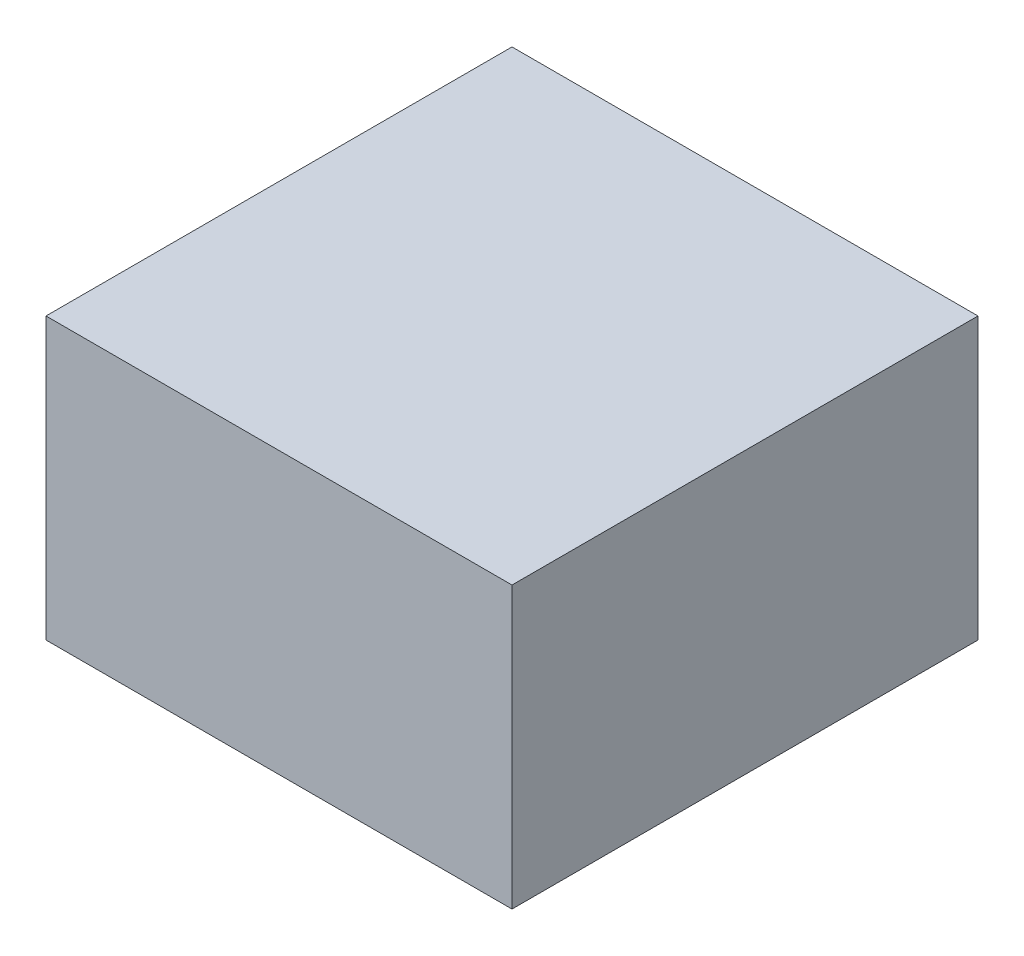
ISO-10303-21;
HEADER;
FILE_DESCRIPTION(('STEP AP214'),'2;1');
FILE_NAME('part.step','',(''),(''),'','','');
FILE_SCHEMA(('AUTOMOTIVE_DESIGN { 1 0 10303 214 1 1 1 1 }'));
ENDSEC;
DATA;
#1=APPLICATION_CONTEXT('core data for automotive mechanical design processes');
#2=APPLICATION_PROTOCOL_DEFINITION('international standard','automotive_design',2000,#1);
#3=PRODUCT_CONTEXT('',#1,'mechanical');
#4=PRODUCT('Part','Part','',(#3));
#5=PRODUCT_RELATED_PRODUCT_CATEGORY('part','',(#4));
#6=PRODUCT_DEFINITION_FORMATION('','',#4);
#7=PRODUCT_DEFINITION_CONTEXT('part definition',#1,'design');
#8=PRODUCT_DEFINITION('design','',#6,#7);
#9=PRODUCT_DEFINITION_SHAPE('','',#8);
#10=(LENGTH_UNIT() NAMED_UNIT(*) SI_UNIT(.MILLI.,.METRE.));
#11=(NAMED_UNIT(*) PLANE_ANGLE_UNIT() SI_UNIT($,.RADIAN.));
#12=(NAMED_UNIT(*) SI_UNIT($,.STERADIAN.) SOLID_ANGLE_UNIT());
#13=UNCERTAINTY_MEASURE_WITH_UNIT(LENGTH_MEASURE(1.E-05),#10,'distance_accuracy_value','');
#14=(GEOMETRIC_REPRESENTATION_CONTEXT(3) GLOBAL_UNCERTAINTY_ASSIGNED_CONTEXT((#13)) GLOBAL_UNIT_ASSIGNED_CONTEXT((#10,
#11,#12)) REPRESENTATION_CONTEXT('',''));
#15=CARTESIAN_POINT('',(0.,0.,0.));
#16=DIRECTION('',(0.,0.,1.));
#17=DIRECTION('',(1.,0.,0.));
#18=AXIS2_PLACEMENT_3D('',#15,#16,#17);
#19=CARTESIAN_POINT('',(22.,26.5,-22.));
#20=DIRECTION('',(-1.,0.,0.));
#21=DIRECTION('',(0.,0.,1.));
#22=AXIS2_PLACEMENT_3D('',#19,#20,#21);
#23=PLANE('',#22);
#24=DIRECTION('',(0.,0.,-1.));
#25=VECTOR('',#24,1.);
#26=CARTESIAN_POINT('',(22.,0.,-22.));
#27=LINE('',#26,#25);
#28=CARTESIAN_POINT('',(22.,0.,22.));
#29=VERTEX_POINT('',#28);
#30=CARTESIAN_POINT('',(22.,0.,-22.));
#31=VERTEX_POINT('',#30);
#32=EDGE_CURVE('E95',#29,#31,#27,.T.);
#33=ORIENTED_EDGE('',*,*,#32,.T.);
#34=DIRECTION('',(0.,-1.,0.));
#35=VECTOR('',#34,1.);
#36=CARTESIAN_POINT('',(22.,26.5,-22.));
#37=LINE('',#36,#35);
#38=CARTESIAN_POINT('',(22.,26.5,-22.));
#39=VERTEX_POINT('',#38);
#40=EDGE_CURVE('E11',#39,#31,#37,.T.);
#41=ORIENTED_EDGE('',*,*,#40,.F.);
#42=DIRECTION('',(0.,0.,-1.));
#43=VECTOR('',#42,1.);
#44=CARTESIAN_POINT('',(22.,26.5,-22.));
#45=LINE('',#44,#43);
#46=CARTESIAN_POINT('',(22.,26.5,22.));
#47=VERTEX_POINT('',#46);
#48=EDGE_CURVE('E83',#47,#39,#45,.T.);
#49=ORIENTED_EDGE('',*,*,#48,.F.);
#50=DIRECTION('',(0.,-1.,0.));
#51=VECTOR('',#50,1.);
#52=CARTESIAN_POINT('',(22.,26.5,22.));
#53=LINE('',#52,#51);
#54=EDGE_CURVE('E91',#47,#29,#53,.T.);
#55=ORIENTED_EDGE('',*,*,#54,.T.);
#56=EDGE_LOOP('',(#33,#41,#49,#55));
#57=FACE_BOUND('',#56,.T.);
#58=ADVANCED_FACE('F32',(#57),#23,.F.);
#59=CARTESIAN_POINT('',(-22.,26.5,-22.));
#60=DIRECTION('',(0.,0.,1.));
#61=DIRECTION('',(1.,0.,0.));
#62=AXIS2_PLACEMENT_3D('',#59,#60,#61);
#63=PLANE('',#62);
#64=DIRECTION('',(-1.,0.,0.));
#65=VECTOR('',#64,1.);
#66=CARTESIAN_POINT('',(-22.,0.,-22.));
#67=LINE('',#66,#65);
#68=CARTESIAN_POINT('',(-22.,0.,-22.));
#69=VERTEX_POINT('',#68);
#70=EDGE_CURVE('E87',#31,#69,#67,.T.);
#71=ORIENTED_EDGE('',*,*,#70,.T.);
#72=DIRECTION('',(0.,-1.,0.));
#73=VECTOR('',#72,1.);
#74=CARTESIAN_POINT('',(-22.,26.5,-22.));
#75=LINE('',#74,#73);
#76=CARTESIAN_POINT('',(-22.,26.5,-22.));
#77=VERTEX_POINT('',#76);
#78=EDGE_CURVE('E40',#77,#69,#75,.T.);
#79=ORIENTED_EDGE('',*,*,#78,.F.);
#80=DIRECTION('',(-1.,0.,0.));
#81=VECTOR('',#80,1.);
#82=CARTESIAN_POINT('',(-22.,26.5,-22.));
#83=LINE('',#82,#81);
#84=EDGE_CURVE('E78',#39,#77,#83,.T.);
#85=ORIENTED_EDGE('',*,*,#84,.F.);
#86=ORIENTED_EDGE('',*,*,#40,.T.);
#87=EDGE_LOOP('',(#71,#79,#85,#86));
#88=FACE_BOUND('',#87,.T.);
#89=ADVANCED_FACE('F86',(#88),#63,.F.);
#90=CARTESIAN_POINT('',(-22.,26.5,-22.));
#91=DIRECTION('',(1.,0.,0.));
#92=DIRECTION('',(0.,0.,-1.));
#93=AXIS2_PLACEMENT_3D('',#90,#91,#92);
#94=PLANE('',#93);
#95=DIRECTION('',(0.,0.,1.));
#96=VECTOR('',#95,1.);
#97=CARTESIAN_POINT('',(-22.,0.,-22.));
#98=LINE('',#97,#96);
#99=CARTESIAN_POINT('',(-22.,0.,22.));
#100=VERTEX_POINT('',#99);
#101=EDGE_CURVE('E65',#69,#100,#98,.T.);
#102=ORIENTED_EDGE('',*,*,#101,.T.);
#103=DIRECTION('',(0.,-1.,0.));
#104=VECTOR('',#103,1.);
#105=CARTESIAN_POINT('',(-22.,26.5,22.));
#106=LINE('',#105,#104);
#107=CARTESIAN_POINT('',(-22.,26.5,22.));
#108=VERTEX_POINT('',#107);
#109=EDGE_CURVE('E88',#108,#100,#106,.T.);
#110=ORIENTED_EDGE('',*,*,#109,.F.);
#111=DIRECTION('',(0.,0.,1.));
#112=VECTOR('',#111,1.);
#113=CARTESIAN_POINT('',(-22.,26.5,-22.));
#114=LINE('',#113,#112);
#115=EDGE_CURVE('E81',#77,#108,#114,.T.);
#116=ORIENTED_EDGE('',*,*,#115,.F.);
#117=ORIENTED_EDGE('',*,*,#78,.T.);
#118=EDGE_LOOP('',(#102,#110,#116,#117));
#119=FACE_BOUND('',#118,.T.);
#120=ADVANCED_FACE('F89',(#119),#94,.F.);
#121=CARTESIAN_POINT('',(-22.,26.5,22.));
#122=DIRECTION('',(0.,0.,-1.));
#123=DIRECTION('',(-1.,0.,0.));
#124=AXIS2_PLACEMENT_3D('',#121,#122,#123);
#125=PLANE('',#124);
#126=DIRECTION('',(1.,0.,0.));
#127=VECTOR('',#126,1.);
#128=CARTESIAN_POINT('',(-22.,0.,22.));
#129=LINE('',#128,#127);
#130=EDGE_CURVE('E71',#100,#29,#129,.T.);
#131=ORIENTED_EDGE('',*,*,#130,.T.);
#132=ORIENTED_EDGE('',*,*,#54,.F.);
#133=DIRECTION('',(1.,0.,0.));
#134=VECTOR('',#133,1.);
#135=CARTESIAN_POINT('',(-22.,26.5,22.));
#136=LINE('',#135,#134);
#137=EDGE_CURVE('E48',#108,#47,#136,.T.);
#138=ORIENTED_EDGE('',*,*,#137,.F.);
#139=ORIENTED_EDGE('',*,*,#109,.T.);
#140=EDGE_LOOP('',(#131,#132,#138,#139));
#141=FACE_BOUND('',#140,.T.);
#142=ADVANCED_FACE('F102',(#141),#125,.F.);
#143=CARTESIAN_POINT('',(0.,26.5,0.));
#144=DIRECTION('',(0.,1.,0.));
#145=DIRECTION('',(0.,0.,1.));
#146=AXIS2_PLACEMENT_3D('',#143,#144,#145);
#147=PLANE('',#146);
#148=ORIENTED_EDGE('',*,*,#48,.T.);
#149=ORIENTED_EDGE('',*,*,#84,.T.);
#150=ORIENTED_EDGE('',*,*,#115,.T.);
#151=ORIENTED_EDGE('',*,*,#137,.T.);
#152=EDGE_LOOP('',(#148,#149,#150,#151));
#153=FACE_BOUND('',#152,.T.);
#154=ADVANCED_FACE('F79',(#153),#147,.T.);
#155=CARTESIAN_POINT('',(0.,0.,0.));
#156=DIRECTION('',(0.,1.,0.));
#157=DIRECTION('',(0.,0.,1.));
#158=AXIS2_PLACEMENT_3D('',#155,#156,#157);
#159=PLANE('',#158);
#160=ORIENTED_EDGE('',*,*,#32,.F.);
#161=ORIENTED_EDGE('',*,*,#130,.F.);
#162=ORIENTED_EDGE('',*,*,#101,.F.);
#163=ORIENTED_EDGE('',*,*,#70,.F.);
#164=EDGE_LOOP('',(#160,#161,#162,#163));
#165=FACE_BOUND('',#164,.T.);
#166=ADVANCED_FACE('F105',(#165),#159,.F.);
#167=CLOSED_SHELL('',(#58,#89,#120,#142,#154,#166));
#168=MANIFOLD_SOLID_BREP('B2',#167);
#169=ADVANCED_BREP_SHAPE_REPRESENTATION('',(#18,#168),#14);
#170=SHAPE_DEFINITION_REPRESENTATION(#9,#169);
ENDSEC;
END-ISO-10303-21;
